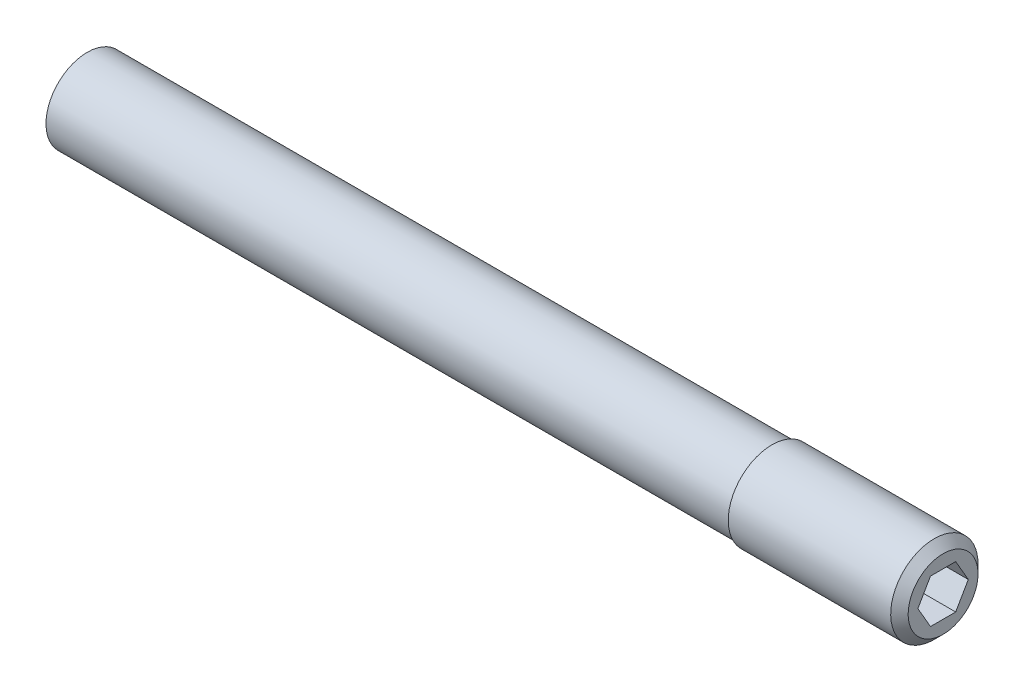
ISO-10303-21;
HEADER;
FILE_DESCRIPTION(('STEP AP214'),'2;1');
FILE_NAME('part.step','',(''),(''),'','','');
FILE_SCHEMA(('AUTOMOTIVE_DESIGN { 1 0 10303 214 1 1 1 1 }'));
ENDSEC;
DATA;
#1=APPLICATION_CONTEXT('core data for automotive mechanical design processes');
#2=APPLICATION_PROTOCOL_DEFINITION('international standard','automotive_design',2000,#1);
#3=PRODUCT_CONTEXT('',#1,'mechanical');
#4=PRODUCT('Part','Part','',(#3));
#5=PRODUCT_RELATED_PRODUCT_CATEGORY('part','',(#4));
#6=PRODUCT_DEFINITION_FORMATION('','',#4);
#7=PRODUCT_DEFINITION_CONTEXT('part definition',#1,'design');
#8=PRODUCT_DEFINITION('design','',#6,#7);
#9=PRODUCT_DEFINITION_SHAPE('','',#8);
#10=(LENGTH_UNIT() NAMED_UNIT(*) SI_UNIT(.MILLI.,.METRE.));
#11=(NAMED_UNIT(*) PLANE_ANGLE_UNIT() SI_UNIT($,.RADIAN.));
#12=(NAMED_UNIT(*) SI_UNIT($,.STERADIAN.) SOLID_ANGLE_UNIT());
#13=UNCERTAINTY_MEASURE_WITH_UNIT(LENGTH_MEASURE(1.E-05),#10,'distance_accuracy_value','');
#14=(GEOMETRIC_REPRESENTATION_CONTEXT(3) GLOBAL_UNCERTAINTY_ASSIGNED_CONTEXT((#13)) GLOBAL_UNIT_ASSIGNED_CONTEXT((#10,
#11,#12)) REPRESENTATION_CONTEXT('',''));
#15=CARTESIAN_POINT('',(0.,0.,0.));
#16=DIRECTION('',(0.,0.,1.));
#17=DIRECTION('',(1.,0.,0.));
#18=AXIS2_PLACEMENT_3D('',#15,#16,#17);
#19=CARTESIAN_POINT('',(0.,3.96875,0.));
#20=DIRECTION('',(-1.,0.,0.));
#21=DIRECTION('',(0.,0.,1.));
#22=AXIS2_PLACEMENT_3D('',#19,#20,#21);
#23=PLANE('',#22);
#24=CARTESIAN_POINT('',(0.,0.,0.));
#25=DIRECTION('',(1.,0.,0.));
#26=DIRECTION('',(0.,1.,0.));
#27=AXIS2_PLACEMENT_3D('',#24,#25,#26);
#28=CIRCLE('',#27,7.5057);
#29=CARTESIAN_POINT('',(0.,7.5057,0.));
#30=VERTEX_POINT('',#29);
#31=EDGE_CURVE('E11',#30,#30,#28,.T.);
#32=ORIENTED_EDGE('',*,*,#31,.T.);
#33=EDGE_LOOP('',(#32));
#34=FACE_BOUND('',#33,.T.);
#35=CARTESIAN_POINT('',(0.,0.,0.));
#36=DIRECTION('',(1.,0.,0.));
#37=DIRECTION('',(0.,1.,0.));
#38=AXIS2_PLACEMENT_3D('',#35,#36,#37);
#39=CIRCLE('',#38,7.9375);
#40=CARTESIAN_POINT('',(0.,7.9375,0.));
#41=VERTEX_POINT('',#40);
#42=EDGE_CURVE('E185',#41,#41,#39,.T.);
#43=ORIENTED_EDGE('',*,*,#42,.F.);
#44=EDGE_LOOP('',(#43));
#45=FACE_BOUND('',#44,.T.);
#46=ADVANCED_FACE('F16',(#34,#45),#23,.T.);
#47=CARTESIAN_POINT('',(-62.23,0.,0.));
#48=DIRECTION('',(1.,0.,0.));
#49=DIRECTION('',(0.,1.,0.));
#50=AXIS2_PLACEMENT_3D('',#47,#48,#49);
#51=CYLINDRICAL_SURFACE('',#50,7.5057);
#52=CARTESIAN_POINT('',(-124.46,0.,0.));
#53=DIRECTION('',(1.,0.,0.));
#54=DIRECTION('',(0.,1.,0.));
#55=AXIS2_PLACEMENT_3D('',#52,#53,#54);
#56=CIRCLE('',#55,7.5057);
#57=CARTESIAN_POINT('',(-124.46,7.5057,0.));
#58=VERTEX_POINT('',#57);
#59=EDGE_CURVE('E27',#58,#58,#56,.T.);
#60=ORIENTED_EDGE('',*,*,#59,.T.);
#61=EDGE_LOOP('',(#60));
#62=FACE_BOUND('',#61,.T.);
#63=ORIENTED_EDGE('',*,*,#31,.F.);
#64=EDGE_LOOP('',(#63));
#65=FACE_BOUND('',#64,.T.);
#66=ADVANCED_FACE('F267',(#62,#65),#51,.T.);
#67=CARTESIAN_POINT('',(-124.46,3.75285,0.));
#68=DIRECTION('',(-1.,0.,0.));
#69=DIRECTION('',(0.,0.,1.));
#70=AXIS2_PLACEMENT_3D('',#67,#68,#69);
#71=PLANE('',#70);
#72=ORIENTED_EDGE('',*,*,#59,.F.);
#73=EDGE_LOOP('',(#72));
#74=FACE_BOUND('',#73,.T.);
#75=ADVANCED_FACE('F258',(#74),#71,.T.);
#76=CARTESIAN_POINT('',(31.115,3.96875,0.));
#77=DIRECTION('',(1.,0.,0.));
#78=DIRECTION('',(0.,1.,0.));
#79=AXIS2_PLACEMENT_3D('',#76,#77,#78);
#80=PLANE('',#79);
#81=DIRECTION('',(0.,0.,-1.));
#82=VECTOR('',#81,1.);
#83=CARTESIAN_POINT('',(31.115,3.96875,2.29135888084632));
#84=LINE('',#83,#82);
#85=CARTESIAN_POINT('',(31.115,3.96875,2.29135888084632));
#86=VERTEX_POINT('',#85);
#87=CARTESIAN_POINT('',(31.115,3.96875,-2.29135888084632));
#88=VERTEX_POINT('',#87);
#89=EDGE_CURVE('E175',#86,#88,#84,.T.);
#90=ORIENTED_EDGE('',*,*,#89,.T.);
#91=DIRECTION('',(0.,-0.866025403784439,-0.5));
#92=VECTOR('',#91,1.);
#93=CARTESIAN_POINT('',(31.115,3.96875,-2.29135888084632));
#94=LINE('',#93,#92);
#95=CARTESIAN_POINT('',(31.115,0.,-4.58271776169265));
#96=VERTEX_POINT('',#95);
#97=EDGE_CURVE('E180',#88,#96,#94,.T.);
#98=ORIENTED_EDGE('',*,*,#97,.T.);
#99=DIRECTION('',(0.,-0.866025403784439,0.5));
#100=VECTOR('',#99,1.);
#101=CARTESIAN_POINT('',(31.115,0.,-4.58271776169265));
#102=LINE('',#101,#100);
#103=CARTESIAN_POINT('',(31.115,-3.96875,-2.29135888084632));
#104=VERTEX_POINT('',#103);
#105=EDGE_CURVE('E130',#96,#104,#102,.T.);
#106=ORIENTED_EDGE('',*,*,#105,.T.);
#107=DIRECTION('',(0.,0.,1.));
#108=VECTOR('',#107,1.);
#109=CARTESIAN_POINT('',(31.115,-3.96875,-2.29135888084632));
#110=LINE('',#109,#108);
#111=CARTESIAN_POINT('',(31.115,-3.96875,2.29135888084632));
#112=VERTEX_POINT('',#111);
#113=EDGE_CURVE('E136',#104,#112,#110,.T.);
#114=ORIENTED_EDGE('',*,*,#113,.T.);
#115=DIRECTION('',(0.,0.866025403784439,0.5));
#116=VECTOR('',#115,1.);
#117=CARTESIAN_POINT('',(31.115,-3.96875,2.29135888084632));
#118=LINE('',#117,#116);
#119=CARTESIAN_POINT('',(31.115,0.,4.58271776169265));
#120=VERTEX_POINT('',#119);
#121=EDGE_CURVE('E105',#112,#120,#118,.T.);
#122=ORIENTED_EDGE('',*,*,#121,.T.);
#123=DIRECTION('',(0.,0.866025403784439,-0.5));
#124=VECTOR('',#123,1.);
#125=CARTESIAN_POINT('',(31.115,0.,4.58271776169265));
#126=LINE('',#125,#124);
#127=EDGE_CURVE('E152',#120,#86,#126,.T.);
#128=ORIENTED_EDGE('',*,*,#127,.T.);
#129=EDGE_LOOP('',(#90,#98,#106,#114,#122,#128));
#130=FACE_BOUND('',#129,.T.);
#131=CARTESIAN_POINT('',(31.115,0.,0.));
#132=DIRECTION('',(-1.,0.,0.));
#133=DIRECTION('',(0.,-1.,0.));
#134=AXIS2_PLACEMENT_3D('',#131,#132,#133);
#135=CIRCLE('',#134,6.35);
#136=CARTESIAN_POINT('',(31.115,6.35,0.));
#137=VERTEX_POINT('',#136);
#138=EDGE_CURVE('E188',#137,#137,#135,.T.);
#139=ORIENTED_EDGE('',*,*,#138,.F.);
#140=EDGE_LOOP('',(#139));
#141=FACE_BOUND('',#140,.T.);
#142=ADVANCED_FACE('F255',(#130,#141),#80,.T.);
#143=CARTESIAN_POINT('',(15.5575,0.,0.));
#144=DIRECTION('',(1.,0.,0.));
#145=DIRECTION('',(0.,1.,0.));
#146=AXIS2_PLACEMENT_3D('',#143,#144,#145);
#147=CYLINDRICAL_SURFACE('',#146,7.9375);
#148=CARTESIAN_POINT('',(29.5275,0.,0.));
#149=DIRECTION('',(1.,0.,0.));
#150=DIRECTION('',(0.,-1.,0.));
#151=AXIS2_PLACEMENT_3D('',#148,#149,#150);
#152=CIRCLE('',#151,7.9375);
#153=CARTESIAN_POINT('',(29.5275,7.9375,0.));
#154=VERTEX_POINT('',#153);
#155=EDGE_CURVE('E184',#154,#154,#152,.T.);
#156=ORIENTED_EDGE('',*,*,#155,.F.);
#157=EDGE_LOOP('',(#156));
#158=FACE_BOUND('',#157,.T.);
#159=ORIENTED_EDGE('',*,*,#42,.T.);
#160=EDGE_LOOP('',(#159));
#161=FACE_BOUND('',#160,.T.);
#162=ADVANCED_FACE('F257',(#158,#161),#147,.T.);
#163=CARTESIAN_POINT('',(30.32125,0.,0.));
#164=DIRECTION('',(-1.,0.,0.));
#165=DIRECTION('',(0.,-1.,0.));
#166=AXIS2_PLACEMENT_3D('',#163,#164,#165);
#167=CONICAL_SURFACE('',#166,7.14375,0.785398162499998);
#168=ORIENTED_EDGE('',*,*,#138,.T.);
#169=EDGE_LOOP('',(#168));
#170=FACE_BOUND('',#169,.T.);
#171=ORIENTED_EDGE('',*,*,#155,.T.);
#172=EDGE_LOOP('',(#171));
#173=FACE_BOUND('',#172,.T.);
#174=ADVANCED_FACE('F252',(#170,#173),#167,.T.);
#175=CARTESIAN_POINT('',(24.765,0.,0.));
#176=DIRECTION('',(1.,0.,0.));
#177=DIRECTION('',(0.,1.,0.));
#178=AXIS2_PLACEMENT_3D('',#175,#176,#177);
#179=PLANE('',#178);
#180=DIRECTION('',(0.,0.,1.));
#181=VECTOR('',#180,1.);
#182=CARTESIAN_POINT('',(24.765,3.96875,-2.29135888084632));
#183=LINE('',#182,#181);
#184=CARTESIAN_POINT('',(24.765,3.96875,-2.29135888084632));
#185=VERTEX_POINT('',#184);
#186=CARTESIAN_POINT('',(24.765,3.96875,2.29135888084632));
#187=VERTEX_POINT('',#186);
#188=EDGE_CURVE('E156',#185,#187,#183,.T.);
#189=ORIENTED_EDGE('',*,*,#188,.T.);
#190=DIRECTION('',(0.,-0.866025403784439,0.5));
#191=VECTOR('',#190,1.);
#192=CARTESIAN_POINT('',(24.765,3.96875,2.29135888084632));
#193=LINE('',#192,#191);
#194=CARTESIAN_POINT('',(24.765,0.,4.58271776169265));
#195=VERTEX_POINT('',#194);
#196=EDGE_CURVE('E67',#187,#195,#193,.T.);
#197=ORIENTED_EDGE('',*,*,#196,.T.);
#198=DIRECTION('',(0.,-0.866025403784439,-0.5));
#199=VECTOR('',#198,1.);
#200=CARTESIAN_POINT('',(24.765,0.,4.58271776169265));
#201=LINE('',#200,#199);
#202=CARTESIAN_POINT('',(24.765,-3.96875,2.29135888084632));
#203=VERTEX_POINT('',#202);
#204=EDGE_CURVE('E116',#195,#203,#201,.T.);
#205=ORIENTED_EDGE('',*,*,#204,.T.);
#206=DIRECTION('',(0.,0.,-1.));
#207=VECTOR('',#206,1.);
#208=CARTESIAN_POINT('',(24.765,-3.96875,2.29135888084632));
#209=LINE('',#208,#207);
#210=CARTESIAN_POINT('',(24.765,-3.96875,-2.29135888084632));
#211=VERTEX_POINT('',#210);
#212=EDGE_CURVE('E135',#203,#211,#209,.T.);
#213=ORIENTED_EDGE('',*,*,#212,.T.);
#214=DIRECTION('',(0.,0.866025403784439,-0.5));
#215=VECTOR('',#214,1.);
#216=CARTESIAN_POINT('',(24.765,-3.96875,-2.29135888084632));
#217=LINE('',#216,#215);
#218=CARTESIAN_POINT('',(24.765,0.,-4.58271776169265));
#219=VERTEX_POINT('',#218);
#220=EDGE_CURVE('E122',#211,#219,#217,.T.);
#221=ORIENTED_EDGE('',*,*,#220,.T.);
#222=DIRECTION('',(0.,0.866025403784439,0.5));
#223=VECTOR('',#222,1.);
#224=CARTESIAN_POINT('',(24.765,0.,-4.58271776169265));
#225=LINE('',#224,#223);
#226=EDGE_CURVE('E54',#219,#185,#225,.T.);
#227=ORIENTED_EDGE('',*,*,#226,.T.);
#228=EDGE_LOOP('',(#189,#197,#205,#213,#221,#227));
#229=FACE_BOUND('',#228,.T.);
#230=ADVANCED_FACE('F139',(#229),#179,.T.);
#231=CARTESIAN_POINT('',(31.115,0.,-4.58271776169265));
#232=DIRECTION('',(0.,0.5,-0.866025403784439));
#233=DIRECTION('',(-1.,0.,0.));
#234=AXIS2_PLACEMENT_3D('',#231,#232,#233);
#235=PLANE('',#234);
#236=ORIENTED_EDGE('',*,*,#226,.F.);
#237=DIRECTION('',(-1.,0.,0.));
#238=VECTOR('',#237,1.);
#239=CARTESIAN_POINT('',(31.115,0.,-4.58271776169265));
#240=LINE('',#239,#238);
#241=EDGE_CURVE('E20',#96,#219,#240,.T.);
#242=ORIENTED_EDGE('',*,*,#241,.F.);
#243=ORIENTED_EDGE('',*,*,#97,.F.);
#244=DIRECTION('',(-1.,0.,0.));
#245=VECTOR('',#244,1.);
#246=CARTESIAN_POINT('',(31.115,3.96875,-2.29135888084632));
#247=LINE('',#246,#245);
#248=EDGE_CURVE('E158',#88,#185,#247,.T.);
#249=ORIENTED_EDGE('',*,*,#248,.T.);
#250=EDGE_LOOP('',(#236,#242,#243,#249));
#251=FACE_BOUND('',#250,.T.);
#252=ADVANCED_FACE('F289',(#251),#235,.F.);
#253=CARTESIAN_POINT('',(31.115,-3.96875,-2.29135888084632));
#254=DIRECTION('',(0.,-0.5,-0.866025403784439));
#255=DIRECTION('',(0.,-0.866025403784439,0.5));
#256=AXIS2_PLACEMENT_3D('',#253,#254,#255);
#257=PLANE('',#256);
#258=ORIENTED_EDGE('',*,*,#220,.F.);
#259=DIRECTION('',(-1.,0.,0.));
#260=VECTOR('',#259,1.);
#261=CARTESIAN_POINT('',(31.115,-3.96875,-2.29135888084632));
#262=LINE('',#261,#260);
#263=EDGE_CURVE('E125',#104,#211,#262,.T.);
#264=ORIENTED_EDGE('',*,*,#263,.F.);
#265=ORIENTED_EDGE('',*,*,#105,.F.);
#266=ORIENTED_EDGE('',*,*,#241,.T.);
#267=EDGE_LOOP('',(#258,#264,#265,#266));
#268=FACE_BOUND('',#267,.T.);
#269=ADVANCED_FACE('F18',(#268),#257,.F.);
#270=CARTESIAN_POINT('',(31.115,-3.96875,2.29135888084632));
#271=DIRECTION('',(0.,-1.,0.));
#272=DIRECTION('',(0.,0.,-1.));
#273=AXIS2_PLACEMENT_3D('',#270,#271,#272);
#274=PLANE('',#273);
#275=ORIENTED_EDGE('',*,*,#212,.F.);
#276=DIRECTION('',(-1.,0.,0.));
#277=VECTOR('',#276,1.);
#278=CARTESIAN_POINT('',(31.115,-3.96875,2.29135888084632));
#279=LINE('',#278,#277);
#280=EDGE_CURVE('E141',#112,#203,#279,.T.);
#281=ORIENTED_EDGE('',*,*,#280,.F.);
#282=ORIENTED_EDGE('',*,*,#113,.F.);
#283=ORIENTED_EDGE('',*,*,#263,.T.);
#284=EDGE_LOOP('',(#275,#281,#282,#283));
#285=FACE_BOUND('',#284,.T.);
#286=ADVANCED_FACE('F133',(#285),#274,.F.);
#287=CARTESIAN_POINT('',(31.115,0.,4.58271776169265));
#288=DIRECTION('',(0.,-0.5,0.866025403784439));
#289=DIRECTION('',(-1.,0.,0.));
#290=AXIS2_PLACEMENT_3D('',#287,#288,#289);
#291=PLANE('',#290);
#292=ORIENTED_EDGE('',*,*,#204,.F.);
#293=DIRECTION('',(-1.,0.,0.));
#294=VECTOR('',#293,1.);
#295=CARTESIAN_POINT('',(31.115,0.,4.58271776169265));
#296=LINE('',#295,#294);
#297=EDGE_CURVE('E155',#120,#195,#296,.T.);
#298=ORIENTED_EDGE('',*,*,#297,.F.);
#299=ORIENTED_EDGE('',*,*,#121,.F.);
#300=ORIENTED_EDGE('',*,*,#280,.T.);
#301=EDGE_LOOP('',(#292,#298,#299,#300));
#302=FACE_BOUND('',#301,.T.);
#303=ADVANCED_FACE('F285',(#302),#291,.F.);
#304=CARTESIAN_POINT('',(31.115,3.96875,2.29135888084632));
#305=DIRECTION('',(0.,0.5,0.866025403784439));
#306=DIRECTION('',(1.,0.,0.));
#307=AXIS2_PLACEMENT_3D('',#304,#305,#306);
#308=PLANE('',#307);
#309=ORIENTED_EDGE('',*,*,#196,.F.);
#310=DIRECTION('',(-1.,0.,0.));
#311=VECTOR('',#310,1.);
#312=CARTESIAN_POINT('',(31.115,3.96875,2.29135888084632));
#313=LINE('',#312,#311);
#314=EDGE_CURVE('E170',#86,#187,#313,.T.);
#315=ORIENTED_EDGE('',*,*,#314,.F.);
#316=ORIENTED_EDGE('',*,*,#127,.F.);
#317=ORIENTED_EDGE('',*,*,#297,.T.);
#318=EDGE_LOOP('',(#309,#315,#316,#317));
#319=FACE_BOUND('',#318,.T.);
#320=ADVANCED_FACE('F290',(#319),#308,.F.);
#321=CARTESIAN_POINT('',(31.115,3.96875,-2.29135888084632));
#322=DIRECTION('',(0.,1.,0.));
#323=DIRECTION('',(1.,0.,0.));
#324=AXIS2_PLACEMENT_3D('',#321,#322,#323);
#325=PLANE('',#324);
#326=ORIENTED_EDGE('',*,*,#188,.F.);
#327=ORIENTED_EDGE('',*,*,#248,.F.);
#328=ORIENTED_EDGE('',*,*,#89,.F.);
#329=ORIENTED_EDGE('',*,*,#314,.T.);
#330=EDGE_LOOP('',(#326,#327,#328,#329));
#331=FACE_BOUND('',#330,.T.);
#332=ADVANCED_FACE('F282',(#331),#325,.F.);
#333=CLOSED_SHELL('',(#46,#66,#75,#142,#162,#174,#230,#252,#269,#286,#303,#320,#332));
#334=MANIFOLD_SOLID_BREP('B1',#333);
#335=ADVANCED_BREP_SHAPE_REPRESENTATION('',(#18,#334),#14);
#336=SHAPE_DEFINITION_REPRESENTATION(#9,#335);
ENDSEC;
END-ISO-10303-21;
